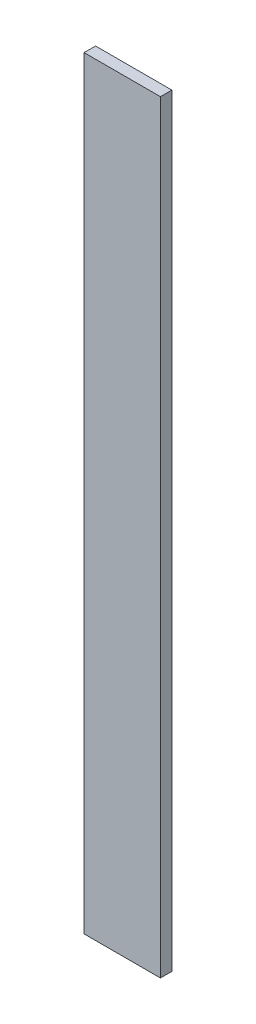
ISO-10303-21;
HEADER;
FILE_DESCRIPTION(('STEP AP214'),'2;1');
FILE_NAME('part.step','',(''),(''),'','','');
FILE_SCHEMA(('AUTOMOTIVE_DESIGN { 1 0 10303 214 1 1 1 1 }'));
ENDSEC;
DATA;
#1=APPLICATION_CONTEXT('core data for automotive mechanical design processes');
#2=APPLICATION_PROTOCOL_DEFINITION('international standard','automotive_design',2000,#1);
#3=PRODUCT_CONTEXT('',#1,'mechanical');
#4=PRODUCT('Part','Part','',(#3));
#5=PRODUCT_RELATED_PRODUCT_CATEGORY('part','',(#4));
#6=PRODUCT_DEFINITION_FORMATION('','',#4);
#7=PRODUCT_DEFINITION_CONTEXT('part definition',#1,'design');
#8=PRODUCT_DEFINITION('design','',#6,#7);
#9=PRODUCT_DEFINITION_SHAPE('','',#8);
#10=(LENGTH_UNIT() NAMED_UNIT(*) SI_UNIT(.MILLI.,.METRE.));
#11=(NAMED_UNIT(*) PLANE_ANGLE_UNIT() SI_UNIT($,.RADIAN.));
#12=(NAMED_UNIT(*) SI_UNIT($,.STERADIAN.) SOLID_ANGLE_UNIT());
#13=UNCERTAINTY_MEASURE_WITH_UNIT(LENGTH_MEASURE(1.E-05),#10,'distance_accuracy_value','');
#14=(GEOMETRIC_REPRESENTATION_CONTEXT(3) GLOBAL_UNCERTAINTY_ASSIGNED_CONTEXT((#13)) GLOBAL_UNIT_ASSIGNED_CONTEXT((#10,
#11,#12)) REPRESENTATION_CONTEXT('',''));
#15=CARTESIAN_POINT('',(0.,0.,0.));
#16=DIRECTION('',(0.,0.,1.));
#17=DIRECTION('',(1.,0.,0.));
#18=AXIS2_PLACEMENT_3D('',#15,#16,#17);
#19=CARTESIAN_POINT('',(-56.5517241379311,297.758620689655,6.));
#20=DIRECTION('',(1.,0.,0.));
#21=DIRECTION('',(0.,1.,0.));
#22=AXIS2_PLACEMENT_3D('',#19,#20,#21);
#23=PLANE('',#22);
#24=DIRECTION('',(0.,-1.,0.));
#25=VECTOR('',#24,1.);
#26=CARTESIAN_POINT('',(-56.5517241379311,297.758620689655,0.));
#27=LINE('',#26,#25);
#28=CARTESIAN_POINT('',(-56.5517241379311,297.758620689655,0.));
#29=VERTEX_POINT('',#28);
#30=CARTESIAN_POINT('',(-56.551724137931,-102.241379310345,0.));
#31=VERTEX_POINT('',#30);
#32=EDGE_CURVE('E98',#29,#31,#27,.T.);
#33=ORIENTED_EDGE('',*,*,#32,.T.);
#34=DIRECTION('',(0.,0.,-1.));
#35=VECTOR('',#34,1.);
#36=CARTESIAN_POINT('',(-56.551724137931,-102.241379310345,6.));
#37=LINE('',#36,#35);
#38=CARTESIAN_POINT('',(-56.551724137931,-102.241379310345,6.));
#39=VERTEX_POINT('',#38);
#40=EDGE_CURVE('E11',#39,#31,#37,.T.);
#41=ORIENTED_EDGE('',*,*,#40,.F.);
#42=DIRECTION('',(0.,-1.,0.));
#43=VECTOR('',#42,1.);
#44=CARTESIAN_POINT('',(-56.5517241379311,297.758620689655,6.));
#45=LINE('',#44,#43);
#46=CARTESIAN_POINT('',(-56.5517241379311,297.758620689655,6.));
#47=VERTEX_POINT('',#46);
#48=EDGE_CURVE('E86',#47,#39,#45,.T.);
#49=ORIENTED_EDGE('',*,*,#48,.F.);
#50=DIRECTION('',(0.,0.,-1.));
#51=VECTOR('',#50,1.);
#52=CARTESIAN_POINT('',(-56.5517241379311,297.758620689655,6.));
#53=LINE('',#52,#51);
#54=EDGE_CURVE('E94',#47,#29,#53,.T.);
#55=ORIENTED_EDGE('',*,*,#54,.T.);
#56=EDGE_LOOP('',(#33,#41,#49,#55));
#57=FACE_BOUND('',#56,.T.);
#58=ADVANCED_FACE('F35',(#57),#23,.F.);
#59=CARTESIAN_POINT('',(-56.551724137931,-102.241379310345,6.));
#60=DIRECTION('',(0.,1.,0.));
#61=DIRECTION('',(0.,0.,1.));
#62=AXIS2_PLACEMENT_3D('',#59,#60,#61);
#63=PLANE('',#62);
#64=DIRECTION('',(1.,0.,0.));
#65=VECTOR('',#64,1.);
#66=CARTESIAN_POINT('',(-56.551724137931,-102.241379310345,0.));
#67=LINE('',#66,#65);
#68=CARTESIAN_POINT('',(-16.551724137931,-102.241379310345,0.));
#69=VERTEX_POINT('',#68);
#70=EDGE_CURVE('E90',#31,#69,#67,.T.);
#71=ORIENTED_EDGE('',*,*,#70,.T.);
#72=DIRECTION('',(0.,0.,-1.));
#73=VECTOR('',#72,1.);
#74=CARTESIAN_POINT('',(-16.551724137931,-102.241379310345,6.));
#75=LINE('',#74,#73);
#76=CARTESIAN_POINT('',(-16.551724137931,-102.241379310345,6.));
#77=VERTEX_POINT('',#76);
#78=EDGE_CURVE('E43',#77,#69,#75,.T.);
#79=ORIENTED_EDGE('',*,*,#78,.F.);
#80=DIRECTION('',(1.,0.,0.));
#81=VECTOR('',#80,1.);
#82=CARTESIAN_POINT('',(-56.551724137931,-102.241379310345,6.));
#83=LINE('',#82,#81);
#84=EDGE_CURVE('E81',#39,#77,#83,.T.);
#85=ORIENTED_EDGE('',*,*,#84,.F.);
#86=ORIENTED_EDGE('',*,*,#40,.T.);
#87=EDGE_LOOP('',(#71,#79,#85,#86));
#88=FACE_BOUND('',#87,.T.);
#89=ADVANCED_FACE('F89',(#88),#63,.F.);
#90=CARTESIAN_POINT('',(-16.551724137931,297.758620689655,6.));
#91=DIRECTION('',(-1.,0.,0.));
#92=DIRECTION('',(0.,-1.,0.));
#93=AXIS2_PLACEMENT_3D('',#90,#91,#92);
#94=PLANE('',#93);
#95=DIRECTION('',(0.,1.,0.));
#96=VECTOR('',#95,1.);
#97=CARTESIAN_POINT('',(-16.551724137931,297.758620689655,0.));
#98=LINE('',#97,#96);
#99=CARTESIAN_POINT('',(-16.551724137931,297.758620689655,0.));
#100=VERTEX_POINT('',#99);
#101=EDGE_CURVE('E68',#69,#100,#98,.T.);
#102=ORIENTED_EDGE('',*,*,#101,.T.);
#103=DIRECTION('',(0.,0.,-1.));
#104=VECTOR('',#103,1.);
#105=CARTESIAN_POINT('',(-16.551724137931,297.758620689655,6.));
#106=LINE('',#105,#104);
#107=CARTESIAN_POINT('',(-16.551724137931,297.758620689655,6.));
#108=VERTEX_POINT('',#107);
#109=EDGE_CURVE('E91',#108,#100,#106,.T.);
#110=ORIENTED_EDGE('',*,*,#109,.F.);
#111=DIRECTION('',(0.,1.,0.));
#112=VECTOR('',#111,1.);
#113=CARTESIAN_POINT('',(-16.551724137931,297.758620689655,6.));
#114=LINE('',#113,#112);
#115=EDGE_CURVE('E84',#77,#108,#114,.T.);
#116=ORIENTED_EDGE('',*,*,#115,.F.);
#117=ORIENTED_EDGE('',*,*,#78,.T.);
#118=EDGE_LOOP('',(#102,#110,#116,#117));
#119=FACE_BOUND('',#118,.T.);
#120=ADVANCED_FACE('F92',(#119),#94,.F.);
#121=CARTESIAN_POINT('',(-56.5517241379311,297.758620689655,6.));
#122=DIRECTION('',(0.,-1.,0.));
#123=DIRECTION('',(0.,0.,-1.));
#124=AXIS2_PLACEMENT_3D('',#121,#122,#123);
#125=PLANE('',#124);
#126=DIRECTION('',(-1.,0.,0.));
#127=VECTOR('',#126,1.);
#128=CARTESIAN_POINT('',(-56.5517241379311,297.758620689655,0.));
#129=LINE('',#128,#127);
#130=EDGE_CURVE('E74',#100,#29,#129,.T.);
#131=ORIENTED_EDGE('',*,*,#130,.T.);
#132=ORIENTED_EDGE('',*,*,#54,.F.);
#133=DIRECTION('',(-1.,0.,0.));
#134=VECTOR('',#133,1.);
#135=CARTESIAN_POINT('',(-56.5517241379311,297.758620689655,6.));
#136=LINE('',#135,#134);
#137=EDGE_CURVE('E51',#108,#47,#136,.T.);
#138=ORIENTED_EDGE('',*,*,#137,.F.);
#139=ORIENTED_EDGE('',*,*,#109,.T.);
#140=EDGE_LOOP('',(#131,#132,#138,#139));
#141=FACE_BOUND('',#140,.T.);
#142=ADVANCED_FACE('F105',(#141),#125,.F.);
#143=CARTESIAN_POINT('',(0.,0.,6.));
#144=DIRECTION('',(0.,0.,1.));
#145=DIRECTION('',(1.,0.,0.));
#146=AXIS2_PLACEMENT_3D('',#143,#144,#145);
#147=PLANE('',#146);
#148=ORIENTED_EDGE('',*,*,#48,.T.);
#149=ORIENTED_EDGE('',*,*,#84,.T.);
#150=ORIENTED_EDGE('',*,*,#115,.T.);
#151=ORIENTED_EDGE('',*,*,#137,.T.);
#152=EDGE_LOOP('',(#148,#149,#150,#151));
#153=FACE_BOUND('',#152,.T.);
#154=ADVANCED_FACE('F82',(#153),#147,.T.);
#155=CARTESIAN_POINT('',(0.,0.,0.));
#156=DIRECTION('',(0.,0.,1.));
#157=DIRECTION('',(1.,0.,0.));
#158=AXIS2_PLACEMENT_3D('',#155,#156,#157);
#159=PLANE('',#158);
#160=ORIENTED_EDGE('',*,*,#32,.F.);
#161=ORIENTED_EDGE('',*,*,#130,.F.);
#162=ORIENTED_EDGE('',*,*,#101,.F.);
#163=ORIENTED_EDGE('',*,*,#70,.F.);
#164=EDGE_LOOP('',(#160,#161,#162,#163));
#165=FACE_BOUND('',#164,.T.);
#166=ADVANCED_FACE('F108',(#165),#159,.F.);
#167=CLOSED_SHELL('',(#58,#89,#120,#142,#154,#166));
#168=MANIFOLD_SOLID_BREP('B2',#167);
#169=ADVANCED_BREP_SHAPE_REPRESENTATION('',(#18,#168),#14);
#170=SHAPE_DEFINITION_REPRESENTATION(#9,#169);
ENDSEC;
END-ISO-10303-21;
